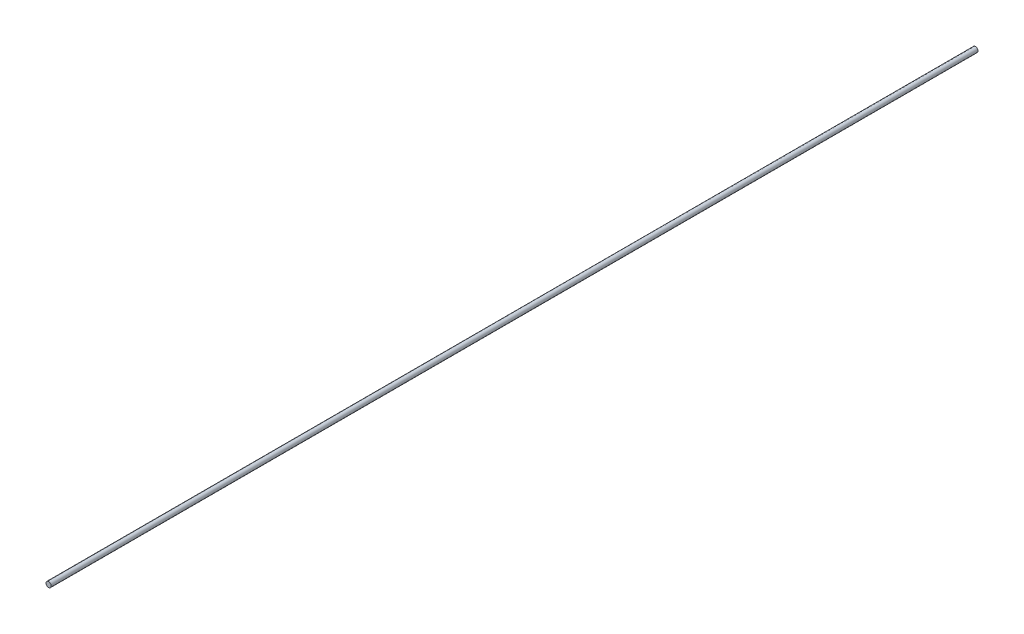
ISO-10303-21;
HEADER;
FILE_DESCRIPTION(('STEP AP214'),'2;1');
FILE_NAME('part.step','',(''),(''),'','','');
FILE_SCHEMA(('AUTOMOTIVE_DESIGN { 1 0 10303 214 1 1 1 1 }'));
ENDSEC;
DATA;
#1=APPLICATION_CONTEXT('core data for automotive mechanical design processes');
#2=APPLICATION_PROTOCOL_DEFINITION('international standard','automotive_design',2000,#1);
#3=PRODUCT_CONTEXT('',#1,'mechanical');
#4=PRODUCT('Part','Part','',(#3));
#5=PRODUCT_RELATED_PRODUCT_CATEGORY('part','',(#4));
#6=PRODUCT_DEFINITION_FORMATION('','',#4);
#7=PRODUCT_DEFINITION_CONTEXT('part definition',#1,'design');
#8=PRODUCT_DEFINITION('design','',#6,#7);
#9=PRODUCT_DEFINITION_SHAPE('','',#8);
#10=(LENGTH_UNIT() NAMED_UNIT(*) SI_UNIT(.MILLI.,.METRE.));
#11=(NAMED_UNIT(*) PLANE_ANGLE_UNIT() SI_UNIT($,.RADIAN.));
#12=(NAMED_UNIT(*) SI_UNIT($,.STERADIAN.) SOLID_ANGLE_UNIT());
#13=UNCERTAINTY_MEASURE_WITH_UNIT(LENGTH_MEASURE(1.E-05),#10,'distance_accuracy_value','');
#14=(GEOMETRIC_REPRESENTATION_CONTEXT(3) GLOBAL_UNCERTAINTY_ASSIGNED_CONTEXT((#13)) GLOBAL_UNIT_ASSIGNED_CONTEXT((#10,
#11,#12)) REPRESENTATION_CONTEXT('',''));
#15=CARTESIAN_POINT('',(0.,0.,0.));
#16=DIRECTION('',(0.,0.,1.));
#17=DIRECTION('',(1.,0.,0.));
#18=AXIS2_PLACEMENT_3D('',#15,#16,#17);
#19=CARTESIAN_POINT('',(0.,0.,1800.));
#20=DIRECTION('',(0.,0.,-1.));
#21=DIRECTION('',(-1.,0.,0.));
#22=AXIS2_PLACEMENT_3D('',#19,#20,#21);
#23=CYLINDRICAL_SURFACE('',#22,5.);
#24=CARTESIAN_POINT('',(0.,0.,1800.));
#25=DIRECTION('',(0.,0.,1.));
#26=DIRECTION('',(1.,0.,0.));
#27=AXIS2_PLACEMENT_3D('',#24,#25,#26);
#28=CIRCLE('',#27,5.);
#29=CARTESIAN_POINT('',(5.,0.,1800.));
#30=VERTEX_POINT('',#29);
#31=EDGE_CURVE('E10',#30,#30,#28,.T.);
#32=ORIENTED_EDGE('',*,*,#31,.F.);
#33=EDGE_LOOP('',(#32));
#34=FACE_BOUND('',#33,.T.);
#35=CARTESIAN_POINT('',(0.,0.,0.));
#36=DIRECTION('',(0.,0.,1.));
#37=DIRECTION('',(1.,0.,0.));
#38=AXIS2_PLACEMENT_3D('',#35,#36,#37);
#39=CIRCLE('',#38,5.);
#40=CARTESIAN_POINT('',(5.,0.,0.));
#41=VERTEX_POINT('',#40);
#42=EDGE_CURVE('E35',#41,#41,#39,.T.);
#43=ORIENTED_EDGE('',*,*,#42,.T.);
#44=EDGE_LOOP('',(#43));
#45=FACE_BOUND('',#44,.T.);
#46=ADVANCED_FACE('F32',(#34,#45),#23,.T.);
#47=CARTESIAN_POINT('',(0.,0.,1800.));
#48=DIRECTION('',(0.,0.,1.));
#49=DIRECTION('',(1.,0.,0.));
#50=AXIS2_PLACEMENT_3D('',#47,#48,#49);
#51=PLANE('',#50);
#52=ORIENTED_EDGE('',*,*,#31,.T.);
#53=EDGE_LOOP('',(#52));
#54=FACE_BOUND('',#53,.T.);
#55=ADVANCED_FACE('F47',(#54),#51,.T.);
#56=CARTESIAN_POINT('',(0.,0.,0.));
#57=DIRECTION('',(0.,0.,1.));
#58=DIRECTION('',(1.,0.,0.));
#59=AXIS2_PLACEMENT_3D('',#56,#57,#58);
#60=PLANE('',#59);
#61=ORIENTED_EDGE('',*,*,#42,.F.);
#62=EDGE_LOOP('',(#61));
#63=FACE_BOUND('',#62,.T.);
#64=ADVANCED_FACE('F45',(#63),#60,.F.);
#65=CLOSED_SHELL('',(#46,#55,#64));
#66=MANIFOLD_SOLID_BREP('B2',#65);
#67=ADVANCED_BREP_SHAPE_REPRESENTATION('',(#18,#66),#14);
#68=SHAPE_DEFINITION_REPRESENTATION(#9,#67);
ENDSEC;
END-ISO-10303-21;
